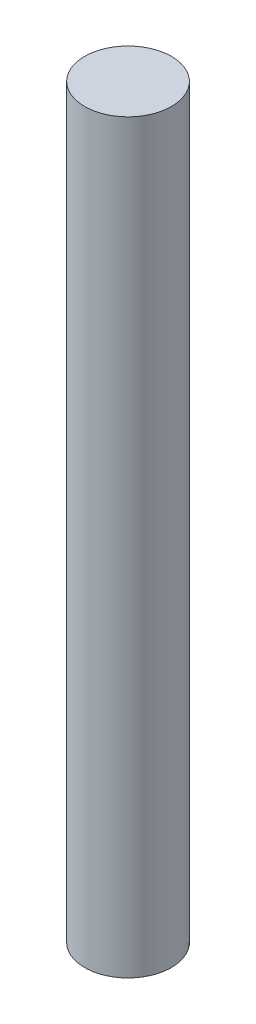
ISO-10303-21;
HEADER;
FILE_DESCRIPTION(('STEP AP214'),'2;1');
FILE_NAME('part.step','',(''),(''),'','','');
FILE_SCHEMA(('AUTOMOTIVE_DESIGN { 1 0 10303 214 1 1 1 1 }'));
ENDSEC;
DATA;
#1=APPLICATION_CONTEXT('core data for automotive mechanical design processes');
#2=APPLICATION_PROTOCOL_DEFINITION('international standard','automotive_design',2000,#1);
#3=PRODUCT_CONTEXT('',#1,'mechanical');
#4=PRODUCT('Part','Part','',(#3));
#5=PRODUCT_RELATED_PRODUCT_CATEGORY('part','',(#4));
#6=PRODUCT_DEFINITION_FORMATION('','',#4);
#7=PRODUCT_DEFINITION_CONTEXT('part definition',#1,'design');
#8=PRODUCT_DEFINITION('design','',#6,#7);
#9=PRODUCT_DEFINITION_SHAPE('','',#8);
#10=(LENGTH_UNIT() NAMED_UNIT(*) SI_UNIT(.MILLI.,.METRE.));
#11=(NAMED_UNIT(*) PLANE_ANGLE_UNIT() SI_UNIT($,.RADIAN.));
#12=(NAMED_UNIT(*) SI_UNIT($,.STERADIAN.) SOLID_ANGLE_UNIT());
#13=UNCERTAINTY_MEASURE_WITH_UNIT(LENGTH_MEASURE(1.E-05),#10,'distance_accuracy_value','');
#14=(GEOMETRIC_REPRESENTATION_CONTEXT(3) GLOBAL_UNCERTAINTY_ASSIGNED_CONTEXT((#13)) GLOBAL_UNIT_ASSIGNED_CONTEXT((#10,
#11,#12)) REPRESENTATION_CONTEXT('',''));
#15=CARTESIAN_POINT('',(0.,0.,0.));
#16=DIRECTION('',(0.,0.,1.));
#17=DIRECTION('',(1.,0.,0.));
#18=AXIS2_PLACEMENT_3D('',#15,#16,#17);
#19=CARTESIAN_POINT('',(0.,185.42,0.));
#20=DIRECTION('',(0.,-1.,0.));
#21=DIRECTION('',(0.,0.,-1.));
#22=AXIS2_PLACEMENT_3D('',#19,#20,#21);
#23=CYLINDRICAL_SURFACE('',#22,10.795);
#24=CARTESIAN_POINT('',(0.,185.42,0.));
#25=DIRECTION('',(0.,1.,0.));
#26=DIRECTION('',(0.,0.,1.));
#27=AXIS2_PLACEMENT_3D('',#24,#25,#26);
#28=CIRCLE('',#27,10.795);
#29=CARTESIAN_POINT('',(0.,185.42,-10.795));
#30=VERTEX_POINT('',#29);
#31=EDGE_CURVE('E10',#30,#30,#28,.T.);
#32=CARTESIAN_POINT('',(0.,0.,0.));
#33=DIRECTION('',(0.,1.,0.));
#34=DIRECTION('',(0.,0.,1.));
#35=AXIS2_PLACEMENT_3D('',#32,#33,#34);
#36=CIRCLE('',#35,10.795);
#37=CARTESIAN_POINT('',(0.,0.,-10.795));
#38=VERTEX_POINT('',#37);
#39=EDGE_CURVE('E46',#38,#38,#36,.T.);
#40=CARTESIAN_POINT('',(0.,185.42,-10.795));
#41=CARTESIAN_POINT('',(0.,183.488541666667,-10.795));
#42=CARTESIAN_POINT('',(0.,181.557083333333,-10.795));
#43=CARTESIAN_POINT('',(0.,177.694166666667,-10.795));
#44=CARTESIAN_POINT('',(0.,175.762708333333,-10.795));
#45=CARTESIAN_POINT('',(0.,171.899791666667,-10.795));
#46=CARTESIAN_POINT('',(0.,169.968333333333,-10.795));
#47=CARTESIAN_POINT('',(0.,166.105416666667,-10.795));
#48=CARTESIAN_POINT('',(0.,164.173958333333,-10.795));
#49=CARTESIAN_POINT('',(0.,160.311041666667,-10.795));
#50=CARTESIAN_POINT('',(0.,158.379583333333,-10.795));
#51=CARTESIAN_POINT('',(0.,154.516666666667,-10.795));
#52=CARTESIAN_POINT('',(0.,152.585208333333,-10.795));
#53=CARTESIAN_POINT('',(0.,148.722291666667,-10.795));
#54=CARTESIAN_POINT('',(0.,146.790833333333,-10.795));
#55=CARTESIAN_POINT('',(0.,142.927916666667,-10.795));
#56=CARTESIAN_POINT('',(0.,140.996458333333,-10.795));
#57=CARTESIAN_POINT('',(0.,137.133541666667,-10.795));
#58=CARTESIAN_POINT('',(0.,135.202083333333,-10.795));
#59=CARTESIAN_POINT('',(0.,131.339166666667,-10.795));
#60=CARTESIAN_POINT('',(0.,129.407708333333,-10.795));
#61=CARTESIAN_POINT('',(0.,125.544791666667,-10.795));
#62=CARTESIAN_POINT('',(0.,123.613333333333,-10.795));
#63=CARTESIAN_POINT('',(0.,119.750416666667,-10.795));
#64=CARTESIAN_POINT('',(0.,117.818958333333,-10.795));
#65=CARTESIAN_POINT('',(0.,113.956041666667,-10.795));
#66=CARTESIAN_POINT('',(0.,112.024583333333,-10.795));
#67=CARTESIAN_POINT('',(0.,108.161666666667,-10.795));
#68=CARTESIAN_POINT('',(0.,106.230208333333,-10.795));
#69=CARTESIAN_POINT('',(0.,102.367291666667,-10.795));
#70=CARTESIAN_POINT('',(0.,100.435833333333,-10.795));
#71=CARTESIAN_POINT('',(0.,96.5729166666667,-10.795));
#72=CARTESIAN_POINT('',(0.,94.6414583333333,-10.795));
#73=CARTESIAN_POINT('',(0.,90.7785416666667,-10.795));
#74=CARTESIAN_POINT('',(0.,88.8470833333333,-10.795));
#75=CARTESIAN_POINT('',(0.,84.9841666666667,-10.795));
#76=CARTESIAN_POINT('',(0.,83.0527083333333,-10.795));
#77=CARTESIAN_POINT('',(0.,79.1897916666667,-10.795));
#78=CARTESIAN_POINT('',(0.,77.2583333333333,-10.795));
#79=CARTESIAN_POINT('',(0.,73.3954166666667,-10.795));
#80=CARTESIAN_POINT('',(0.,71.4639583333333,-10.795));
#81=CARTESIAN_POINT('',(0.,67.6010416666667,-10.795));
#82=CARTESIAN_POINT('',(0.,65.6695833333333,-10.795));
#83=CARTESIAN_POINT('',(0.,61.8066666666667,-10.795));
#84=CARTESIAN_POINT('',(0.,59.8752083333333,-10.795));
#85=CARTESIAN_POINT('',(0.,56.0122916666667,-10.795));
#86=CARTESIAN_POINT('',(0.,54.0808333333333,-10.795));
#87=CARTESIAN_POINT('',(0.,50.2179166666667,-10.795));
#88=CARTESIAN_POINT('',(0.,48.2864583333333,-10.795));
#89=CARTESIAN_POINT('',(0.,44.4235416666667,-10.795));
#90=CARTESIAN_POINT('',(0.,42.4920833333333,-10.795));
#91=CARTESIAN_POINT('',(0.,38.6291666666667,-10.795));
#92=CARTESIAN_POINT('',(0.,36.6977083333333,-10.795));
#93=CARTESIAN_POINT('',(0.,32.8347916666667,-10.795));
#94=CARTESIAN_POINT('',(0.,30.9033333333333,-10.795));
#95=CARTESIAN_POINT('',(0.,27.0404166666667,-10.795));
#96=CARTESIAN_POINT('',(0.,25.1089583333333,-10.795));
#97=CARTESIAN_POINT('',(0.,21.2460416666667,-10.795));
#98=CARTESIAN_POINT('',(0.,19.3145833333333,-10.795));
#99=CARTESIAN_POINT('',(0.,15.4516666666667,-10.795));
#100=CARTESIAN_POINT('',(0.,13.5202083333333,-10.795));
#101=CARTESIAN_POINT('',(0.,9.65729166666667,-10.795));
#102=CARTESIAN_POINT('',(0.,7.72583333333333,-10.795));
#103=CARTESIAN_POINT('',(0.,3.86291666666666,-10.795));
#104=CARTESIAN_POINT('',(0.,1.93145833333333,-10.795));
#105=CARTESIAN_POINT('',(0.,0.,-10.795));
#106=B_SPLINE_CURVE_WITH_KNOTS('',3,(#40,#41,#42,#43,#44,#45,#46,#47,#48,#49,#50,#51,#52,#53,
#54,#55,#56,#57,#58,#59,#60,#61,#62,#63,#64,#65,#66,#67,#68,#69,#70,#71,#72,#73,#74,#75,#76,#77,
#78,#79,#80,#81,#82,#83,#84,#85,#86,#87,#88,#89,#90,#91,#92,#93,#94,#95,#96,#97,#98,#99,#100,
#101,#102,#103,#104,#105),.UNSPECIFIED.,.F.,.F.,(4,2,2,2,2,2,2,2,2,2,2,2,2,2,2,2,2,2,2,2,2,2,2,
2,2,2,2,2,2,2,2,2,4),(0.,5.79437499999999,11.58875,17.383125,23.1775,28.971875,34.76625,
40.560625,46.355,52.149375,57.94375,63.738125,69.5325,75.326875,81.12125,86.915625,92.71,
98.504375,104.29875,110.093125,115.8875,121.681875,127.47625,133.270625,139.065,144.859375,
150.65375,156.448125,162.2425,168.036875,173.83125,179.625625,185.42),.UNSPECIFIED.);
#107=EDGE_CURVE('BSEAM43',#30,#38,#106,.T.);
#108=ORIENTED_EDGE('',*,*,#31,.F.);
#109=ORIENTED_EDGE('',*,*,#39,.T.);
#110=ORIENTED_EDGE('',*,*,#107,.T.);
#111=ORIENTED_EDGE('',*,*,#107,.F.);
#112=EDGE_LOOP('',(#108,#110,#109,#111));
#113=FACE_BOUND('',#112,.T.);
#114=ADVANCED_FACE('F43',(#113),#23,.T.);
#115=CARTESIAN_POINT('',(0.,185.42,0.));
#116=DIRECTION('',(0.,1.,0.));
#117=DIRECTION('',(0.,0.,1.));
#118=AXIS2_PLACEMENT_3D('',#115,#116,#117);
#119=PLANE('',#118);
#120=ORIENTED_EDGE('',*,*,#31,.T.);
#121=EDGE_LOOP('',(#120));
#122=FACE_BOUND('',#121,.T.);
#123=ADVANCED_FACE('F60',(#122),#119,.T.);
#124=CARTESIAN_POINT('',(0.,0.,0.));
#125=DIRECTION('',(0.,1.,0.));
#126=DIRECTION('',(0.,0.,1.));
#127=AXIS2_PLACEMENT_3D('',#124,#125,#126);
#128=PLANE('',#127);
#129=ORIENTED_EDGE('',*,*,#39,.F.);
#130=EDGE_LOOP('',(#129));
#131=FACE_BOUND('',#130,.T.);
#132=ADVANCED_FACE('F58',(#131),#128,.F.);
#133=CLOSED_SHELL('',(#114,#123,#132));
#134=MANIFOLD_SOLID_BREP('B2',#133);
#135=ADVANCED_BREP_SHAPE_REPRESENTATION('',(#18,#134),#14);
#136=SHAPE_DEFINITION_REPRESENTATION(#9,#135);
ENDSEC;
END-ISO-10303-21;
